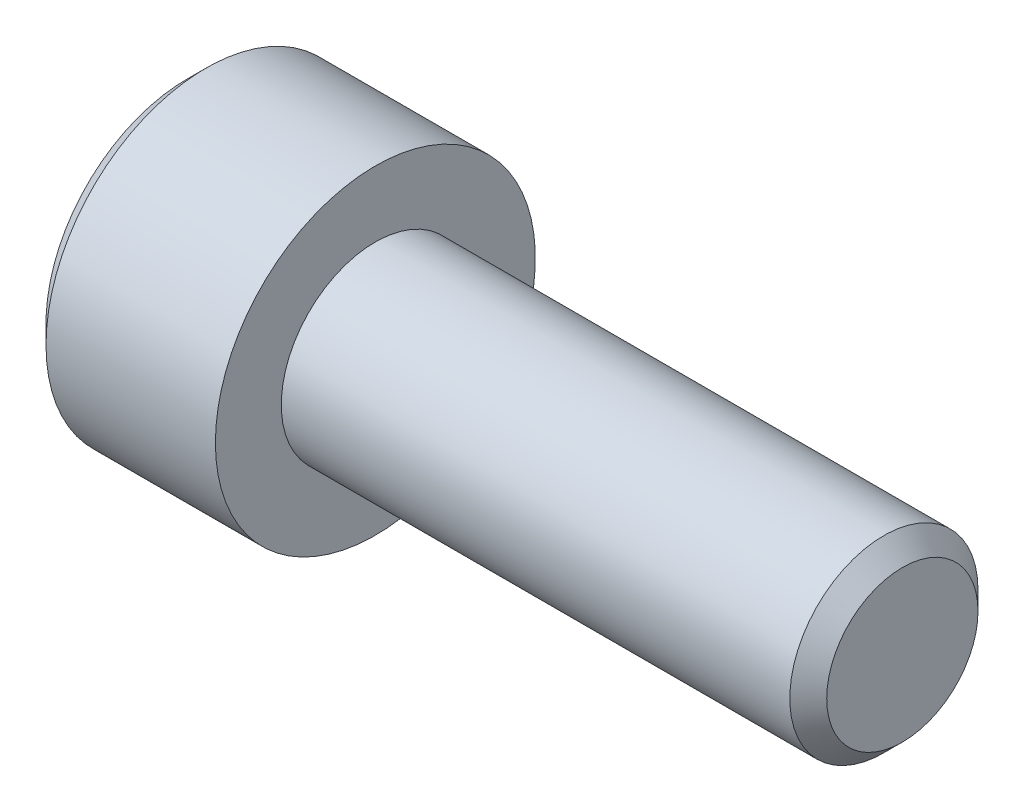
ISO-10303-21;
HEADER;
FILE_DESCRIPTION(('STEP AP214'),'2;1');
FILE_NAME('part.step','',(''),(''),'','','');
FILE_SCHEMA(('AUTOMOTIVE_DESIGN { 1 0 10303 214 1 1 1 1 }'));
ENDSEC;
DATA;
#1=APPLICATION_CONTEXT('core data for automotive mechanical design processes');
#2=APPLICATION_PROTOCOL_DEFINITION('international standard','automotive_design',2000,#1);
#3=PRODUCT_CONTEXT('',#1,'mechanical');
#4=PRODUCT('Part','Part','',(#3));
#5=PRODUCT_RELATED_PRODUCT_CATEGORY('part','',(#4));
#6=PRODUCT_DEFINITION_FORMATION('','',#4);
#7=PRODUCT_DEFINITION_CONTEXT('part definition',#1,'design');
#8=PRODUCT_DEFINITION('design','',#6,#7);
#9=PRODUCT_DEFINITION_SHAPE('','',#8);
#10=(LENGTH_UNIT() NAMED_UNIT(*) SI_UNIT(.MILLI.,.METRE.));
#11=(NAMED_UNIT(*) PLANE_ANGLE_UNIT() SI_UNIT($,.RADIAN.));
#12=(NAMED_UNIT(*) SI_UNIT($,.STERADIAN.) SOLID_ANGLE_UNIT());
#13=UNCERTAINTY_MEASURE_WITH_UNIT(LENGTH_MEASURE(1.E-05),#10,'distance_accuracy_value','');
#14=(GEOMETRIC_REPRESENTATION_CONTEXT(3) GLOBAL_UNCERTAINTY_ASSIGNED_CONTEXT((#13)) GLOBAL_UNIT_ASSIGNED_CONTEXT((#10,
#11,#12)) REPRESENTATION_CONTEXT('',''));
#15=CARTESIAN_POINT('',(0.,0.,0.));
#16=DIRECTION('',(0.,0.,1.));
#17=DIRECTION('',(1.,0.,0.));
#18=AXIS2_PLACEMENT_3D('',#15,#16,#17);
#19=CARTESIAN_POINT('',(-5.,-3.75,3.75));
#20=DIRECTION('',(-1.,0.,0.));
#21=DIRECTION('',(0.,1.,0.));
#22=AXIS2_PLACEMENT_3D('',#19,#20,#21);
#23=PLANE('',#22);
#24=CARTESIAN_POINT('',(-5.,0.,0.));
#25=DIRECTION('',(-1.,0.,0.));
#26=DIRECTION('',(0.,0.,-1.));
#27=AXIS2_PLACEMENT_3D('',#24,#25,#26);
#28=CIRCLE('',#27,3.75);
#29=CARTESIAN_POINT('',(-5.,0.,-3.75));
#30=VERTEX_POINT('',#29);
#31=EDGE_CURVE('E115',#30,#30,#28,.F.);
#32=ORIENTED_EDGE('',*,*,#31,.F.);
#33=EDGE_LOOP('',(#32));
#34=FACE_BOUND('',#33,.T.);
#35=DIRECTION('',(0.,0.499999999999983,-0.866025403784448));
#36=VECTOR('',#35,1.);
#37=CARTESIAN_POINT('',(-5.,-2.3094010767585,0.));
#38=LINE('',#37,#36);
#39=CARTESIAN_POINT('',(-5.,-2.3094010767585,0.));
#40=VERTEX_POINT('',#39);
#41=CARTESIAN_POINT('',(-5.,-1.1547005383793,-2.));
#42=VERTEX_POINT('',#41);
#43=EDGE_CURVE('E100',#40,#42,#38,.T.);
#44=ORIENTED_EDGE('',*,*,#43,.T.);
#45=DIRECTION('',(0.,1.,0.));
#46=VECTOR('',#45,1.);
#47=CARTESIAN_POINT('',(-5.,-1.1547005383793,-2.));
#48=LINE('',#47,#46);
#49=CARTESIAN_POINT('',(-5.,1.1547005383793,-2.));
#50=VERTEX_POINT('',#49);
#51=EDGE_CURVE('E88',#42,#50,#48,.T.);
#52=ORIENTED_EDGE('',*,*,#51,.T.);
#53=DIRECTION('',(0.,0.499999999999983,0.866025403784448));
#54=VECTOR('',#53,1.);
#55=CARTESIAN_POINT('',(-5.,1.1547005383793,-2.));
#56=LINE('',#55,#54);
#57=CARTESIAN_POINT('',(-5.,2.3094010767585,0.));
#58=VERTEX_POINT('',#57);
#59=EDGE_CURVE('E99',#50,#58,#56,.T.);
#60=ORIENTED_EDGE('',*,*,#59,.T.);
#61=DIRECTION('',(0.,-0.499999999999983,0.866025403784448));
#62=VECTOR('',#61,1.);
#63=CARTESIAN_POINT('',(-5.,2.3094010767585,0.));
#64=LINE('',#63,#62);
#65=CARTESIAN_POINT('',(-5.,1.1547005383793,2.));
#66=VERTEX_POINT('',#65);
#67=EDGE_CURVE('E125',#58,#66,#64,.T.);
#68=ORIENTED_EDGE('',*,*,#67,.T.);
#69=DIRECTION('',(0.,-1.,0.));
#70=VECTOR('',#69,1.);
#71=CARTESIAN_POINT('',(-5.,1.1547005383793,2.));
#72=LINE('',#71,#70);
#73=CARTESIAN_POINT('',(-5.,-1.1547005383793,2.));
#74=VERTEX_POINT('',#73);
#75=EDGE_CURVE('E130',#66,#74,#72,.T.);
#76=ORIENTED_EDGE('',*,*,#75,.T.);
#77=DIRECTION('',(0.,-0.499999999999983,-0.866025403784448));
#78=VECTOR('',#77,1.);
#79=CARTESIAN_POINT('',(-5.,-1.1547005383793,2.));
#80=LINE('',#79,#78);
#81=EDGE_CURVE('E114',#74,#40,#80,.T.);
#82=ORIENTED_EDGE('',*,*,#81,.T.);
#83=EDGE_LOOP('',(#44,#52,#60,#68,#76,#82));
#84=FACE_BOUND('',#83,.T.);
#85=ADVANCED_FACE('F16',(#34,#84),#23,.T.);
#86=CARTESIAN_POINT('',(0.,-4.25,-4.25));
#87=DIRECTION('',(1.,0.,0.));
#88=DIRECTION('',(0.,1.,0.));
#89=AXIS2_PLACEMENT_3D('',#86,#87,#88);
#90=PLANE('',#89);
#91=CARTESIAN_POINT('',(0.,0.,0.));
#92=DIRECTION('',(1.,0.,0.));
#93=DIRECTION('',(0.,0.,1.));
#94=AXIS2_PLACEMENT_3D('',#91,#92,#93);
#95=CIRCLE('',#94,4.25);
#96=CARTESIAN_POINT('',(0.,0.,4.25));
#97=VERTEX_POINT('',#96);
#98=EDGE_CURVE('E137',#97,#97,#95,.T.);
#99=ORIENTED_EDGE('',*,*,#98,.T.);
#100=EDGE_LOOP('',(#99));
#101=FACE_BOUND('',#100,.T.);
#102=CARTESIAN_POINT('',(0.,0.,0.));
#103=DIRECTION('',(-1.,0.,0.));
#104=DIRECTION('',(0.,0.,-1.));
#105=AXIS2_PLACEMENT_3D('',#102,#103,#104);
#106=CIRCLE('',#105,2.5);
#107=CARTESIAN_POINT('',(0.,0.,-2.5));
#108=VERTEX_POINT('',#107);
#109=EDGE_CURVE('E142',#108,#108,#106,.F.);
#110=ORIENTED_EDGE('',*,*,#109,.F.);
#111=EDGE_LOOP('',(#110));
#112=FACE_BOUND('',#111,.T.);
#113=ADVANCED_FACE('F264',(#101,#112),#90,.T.);
#114=CARTESIAN_POINT('',(14.,-2.0095,-2.0095));
#115=DIRECTION('',(1.,0.,0.));
#116=DIRECTION('',(0.,1.,0.));
#117=AXIS2_PLACEMENT_3D('',#114,#115,#116);
#118=PLANE('',#117);
#119=CARTESIAN_POINT('',(14.,0.,0.));
#120=DIRECTION('',(1.,0.,0.));
#121=DIRECTION('',(0.,0.,1.));
#122=AXIS2_PLACEMENT_3D('',#119,#120,#121);
#123=CIRCLE('',#122,2.00950000000001);
#124=CARTESIAN_POINT('',(14.,0.,2.00950000000001));
#125=VERTEX_POINT('',#124);
#126=EDGE_CURVE('E145',#125,#125,#123,.T.);
#127=ORIENTED_EDGE('',*,*,#126,.T.);
#128=EDGE_LOOP('',(#127));
#129=FACE_BOUND('',#128,.T.);
#130=ADVANCED_FACE('F270',(#129),#118,.T.);
#131=CARTESIAN_POINT('',(-2.5,-1.1547005383793,2.));
#132=DIRECTION('',(0.,0.,-1.));
#133=DIRECTION('',(-1.,0.,0.));
#134=AXIS2_PLACEMENT_3D('',#131,#132,#133);
#135=PLANE('',#134);
#136=ORIENTED_EDGE('',*,*,#75,.F.);
#137=DIRECTION('',(1.,0.,0.));
#138=VECTOR('',#137,1.);
#139=CARTESIAN_POINT('',(-5.,1.1547005383793,2.));
#140=LINE('',#139,#138);
#141=CARTESIAN_POINT('',(-2.5,1.1547005383793,2.));
#142=VERTEX_POINT('',#141);
#143=EDGE_CURVE('E148',#142,#66,#140,.F.);
#144=ORIENTED_EDGE('',*,*,#143,.F.);
#145=DIRECTION('',(0.,-1.,0.));
#146=VECTOR('',#145,1.);
#147=CARTESIAN_POINT('',(-2.5,1.1547005383793,2.));
#148=LINE('',#147,#146);
#149=CARTESIAN_POINT('',(-2.5,0.,2.));
#150=VERTEX_POINT('',#149);
#151=EDGE_CURVE('E150',#142,#150,#148,.T.);
#152=ORIENTED_EDGE('',*,*,#151,.T.);
#153=DIRECTION('',(0.,-1.,0.));
#154=VECTOR('',#153,1.);
#155=CARTESIAN_POINT('',(-2.5,0.,2.));
#156=LINE('',#155,#154);
#157=CARTESIAN_POINT('',(-2.5,-1.1547005383793,2.));
#158=VERTEX_POINT('',#157);
#159=EDGE_CURVE('E155',#150,#158,#156,.T.);
#160=ORIENTED_EDGE('',*,*,#159,.T.);
#161=DIRECTION('',(-1.,0.,0.));
#162=VECTOR('',#161,1.);
#163=CARTESIAN_POINT('',(-2.5,-1.1547005383793,2.));
#164=LINE('',#163,#162);
#165=EDGE_CURVE('E160',#158,#74,#164,.T.);
#166=ORIENTED_EDGE('',*,*,#165,.T.);
#167=EDGE_LOOP('',(#136,#144,#152,#160,#166));
#168=FACE_BOUND('',#167,.T.);
#169=ADVANCED_FACE('F276',(#168),#135,.T.);
#170=CARTESIAN_POINT('',(-5.,-2.3094010767585,0.));
#171=DIRECTION('',(0.,0.866025403784448,-0.499999999999983));
#172=DIRECTION('',(0.,0.499999999999983,0.866025403784448));
#173=AXIS2_PLACEMENT_3D('',#170,#171,#172);
#174=PLANE('',#173);
#175=ORIENTED_EDGE('',*,*,#81,.F.);
#176=ORIENTED_EDGE('',*,*,#165,.F.);
#177=DIRECTION('',(0.,-0.499999999999983,-0.866025403784448));
#178=VECTOR('',#177,1.);
#179=CARTESIAN_POINT('',(-2.5,-1.1547005383793,2.));
#180=LINE('',#179,#178);
#181=CARTESIAN_POINT('',(-2.5,-1.73205080756891,0.999999999999975));
#182=VERTEX_POINT('',#181);
#183=EDGE_CURVE('E165',#158,#182,#180,.T.);
#184=ORIENTED_EDGE('',*,*,#183,.T.);
#185=DIRECTION('',(0.,-0.499999999999983,-0.866025403784448));
#186=VECTOR('',#185,1.);
#187=CARTESIAN_POINT('',(-2.5,-1.73205080756891,0.999999999999975));
#188=LINE('',#187,#186);
#189=CARTESIAN_POINT('',(-2.5,-2.3094010767585,0.));
#190=VERTEX_POINT('',#189);
#191=EDGE_CURVE('E170',#182,#190,#188,.T.);
#192=ORIENTED_EDGE('',*,*,#191,.T.);
#193=DIRECTION('',(-1.,0.,0.));
#194=VECTOR('',#193,1.);
#195=CARTESIAN_POINT('',(-2.5,-2.3094010767585,0.));
#196=LINE('',#195,#194);
#197=EDGE_CURVE('E175',#190,#40,#196,.T.);
#198=ORIENTED_EDGE('',*,*,#197,.T.);
#199=EDGE_LOOP('',(#175,#176,#184,#192,#198));
#200=FACE_BOUND('',#199,.T.);
#201=ADVANCED_FACE('F280',(#200),#174,.T.);
#202=CARTESIAN_POINT('',(-5.,-1.1547005383793,-2.));
#203=DIRECTION('',(0.,0.866025403784448,0.499999999999983));
#204=DIRECTION('',(0.,-0.499999999999983,0.866025403784448));
#205=AXIS2_PLACEMENT_3D('',#202,#203,#204);
#206=PLANE('',#205);
#207=ORIENTED_EDGE('',*,*,#43,.F.);
#208=ORIENTED_EDGE('',*,*,#197,.F.);
#209=DIRECTION('',(0.,0.499999999999983,-0.866025403784448));
#210=VECTOR('',#209,1.);
#211=CARTESIAN_POINT('',(-2.5,-2.3094010767585,0.));
#212=LINE('',#211,#210);
#213=CARTESIAN_POINT('',(-2.5,-1.73205080756891,-0.999999999999977));
#214=VERTEX_POINT('',#213);
#215=EDGE_CURVE('E179',#190,#214,#212,.T.);
#216=ORIENTED_EDGE('',*,*,#215,.T.);
#217=DIRECTION('',(0.,0.499999999999983,-0.866025403784448));
#218=VECTOR('',#217,1.);
#219=CARTESIAN_POINT('',(-2.5,-1.73205080756891,-0.999999999999977));
#220=LINE('',#219,#218);
#221=CARTESIAN_POINT('',(-2.5,-1.1547005383793,-2.));
#222=VERTEX_POINT('',#221);
#223=EDGE_CURVE('E109',#214,#222,#220,.T.);
#224=ORIENTED_EDGE('',*,*,#223,.T.);
#225=DIRECTION('',(-1.,0.,0.));
#226=VECTOR('',#225,1.);
#227=CARTESIAN_POINT('',(-2.5,-1.1547005383793,-2.));
#228=LINE('',#227,#226);
#229=EDGE_CURVE('E92',#222,#42,#228,.T.);
#230=ORIENTED_EDGE('',*,*,#229,.T.);
#231=EDGE_LOOP('',(#207,#208,#216,#224,#230));
#232=FACE_BOUND('',#231,.T.);
#233=ADVANCED_FACE('F104',(#232),#206,.T.);
#234=CARTESIAN_POINT('',(-5.,-1.1547005383793,-2.));
#235=DIRECTION('',(0.,0.,1.));
#236=DIRECTION('',(1.,0.,0.));
#237=AXIS2_PLACEMENT_3D('',#234,#235,#236);
#238=PLANE('',#237);
#239=ORIENTED_EDGE('',*,*,#51,.F.);
#240=ORIENTED_EDGE('',*,*,#229,.F.);
#241=DIRECTION('',(0.,1.,0.));
#242=VECTOR('',#241,1.);
#243=CARTESIAN_POINT('',(-2.5,-1.1547005383793,-2.));
#244=LINE('',#243,#242);
#245=CARTESIAN_POINT('',(-2.5,0.,-2.));
#246=VERTEX_POINT('',#245);
#247=EDGE_CURVE('E110',#222,#246,#244,.T.);
#248=ORIENTED_EDGE('',*,*,#247,.T.);
#249=DIRECTION('',(0.,1.,0.));
#250=VECTOR('',#249,1.);
#251=CARTESIAN_POINT('',(-2.5,0.,-2.));
#252=LINE('',#251,#250);
#253=CARTESIAN_POINT('',(-2.5,1.1547005383793,-2.));
#254=VERTEX_POINT('',#253);
#255=EDGE_CURVE('E191',#246,#254,#252,.T.);
#256=ORIENTED_EDGE('',*,*,#255,.T.);
#257=DIRECTION('',(-1.,0.,0.));
#258=VECTOR('',#257,1.);
#259=CARTESIAN_POINT('',(-2.5,1.1547005383793,-2.));
#260=LINE('',#259,#258);
#261=EDGE_CURVE('E95',#254,#50,#260,.T.);
#262=ORIENTED_EDGE('',*,*,#261,.T.);
#263=EDGE_LOOP('',(#239,#240,#248,#256,#262));
#264=FACE_BOUND('',#263,.T.);
#265=ADVANCED_FACE('F90',(#264),#238,.T.);
#266=CARTESIAN_POINT('',(-5.,2.3094010767585,0.));
#267=DIRECTION('',(0.,-0.866025403784448,0.499999999999983));
#268=DIRECTION('',(0.,-0.499999999999983,-0.866025403784448));
#269=AXIS2_PLACEMENT_3D('',#266,#267,#268);
#270=PLANE('',#269);
#271=ORIENTED_EDGE('',*,*,#59,.F.);
#272=ORIENTED_EDGE('',*,*,#261,.F.);
#273=DIRECTION('',(0.,0.499999999999983,0.866025403784448));
#274=VECTOR('',#273,1.);
#275=CARTESIAN_POINT('',(-2.5,1.1547005383793,-2.));
#276=LINE('',#275,#274);
#277=CARTESIAN_POINT('',(-2.5,1.73205080756891,-0.999999999999975));
#278=VERTEX_POINT('',#277);
#279=EDGE_CURVE('E198',#254,#278,#276,.T.);
#280=ORIENTED_EDGE('',*,*,#279,.T.);
#281=DIRECTION('',(0.,0.499999999999983,0.866025403784448));
#282=VECTOR('',#281,1.);
#283=CARTESIAN_POINT('',(-2.5,1.73205080756891,-0.999999999999975));
#284=LINE('',#283,#282);
#285=CARTESIAN_POINT('',(-2.5,2.3094010767585,0.));
#286=VERTEX_POINT('',#285);
#287=EDGE_CURVE('E203',#278,#286,#284,.T.);
#288=ORIENTED_EDGE('',*,*,#287,.T.);
#289=DIRECTION('',(-1.,0.,0.));
#290=VECTOR('',#289,1.);
#291=CARTESIAN_POINT('',(-2.5,2.3094010767585,0.));
#292=LINE('',#291,#290);
#293=EDGE_CURVE('E208',#286,#58,#292,.T.);
#294=ORIENTED_EDGE('',*,*,#293,.T.);
#295=EDGE_LOOP('',(#271,#272,#280,#288,#294));
#296=FACE_BOUND('',#295,.T.);
#297=ADVANCED_FACE('F289',(#296),#270,.T.);
#298=CARTESIAN_POINT('',(-5.,1.1547005383793,2.));
#299=DIRECTION('',(0.,-0.866025403784448,-0.499999999999983));
#300=DIRECTION('',(0.,0.499999999999983,-0.866025403784448));
#301=AXIS2_PLACEMENT_3D('',#298,#299,#300);
#302=PLANE('',#301);
#303=ORIENTED_EDGE('',*,*,#67,.F.);
#304=ORIENTED_EDGE('',*,*,#293,.F.);
#305=DIRECTION('',(0.,-0.499999999999983,0.866025403784448));
#306=VECTOR('',#305,1.);
#307=CARTESIAN_POINT('',(-2.5,2.3094010767585,0.));
#308=LINE('',#307,#306);
#309=CARTESIAN_POINT('',(-2.5,1.73205080756891,0.999999999999976));
#310=VERTEX_POINT('',#309);
#311=EDGE_CURVE('E213',#286,#310,#308,.T.);
#312=ORIENTED_EDGE('',*,*,#311,.T.);
#313=DIRECTION('',(0.,-0.499999999999983,0.866025403784448));
#314=VECTOR('',#313,1.);
#315=CARTESIAN_POINT('',(-2.5,1.73205080756891,0.999999999999975));
#316=LINE('',#315,#314);
#317=EDGE_CURVE('E218',#310,#142,#316,.T.);
#318=ORIENTED_EDGE('',*,*,#317,.T.);
#319=ORIENTED_EDGE('',*,*,#143,.T.);
#320=EDGE_LOOP('',(#303,#304,#312,#318,#319));
#321=FACE_BOUND('',#320,.T.);
#322=ADVANCED_FACE('F292',(#321),#302,.T.);
#323=CARTESIAN_POINT('',(-2.5,0.,-0.999999999999974));
#324=DIRECTION('',(-1.,0.,0.));
#325=DIRECTION('',(0.,1.,0.));
#326=AXIS2_PLACEMENT_3D('',#323,#324,#325);
#327=PLANE('',#326);
#328=CARTESIAN_POINT('',(-2.5,0.,0.));
#329=DIRECTION('',(1.,0.,0.));
#330=DIRECTION('',(0.,0.,-1.));
#331=AXIS2_PLACEMENT_3D('',#328,#329,#330);
#332=CIRCLE('',#331,2.);
#333=EDGE_CURVE('E223',#246,#278,#332,.T.);
#334=ORIENTED_EDGE('',*,*,#333,.T.);
#335=ORIENTED_EDGE('',*,*,#279,.F.);
#336=ORIENTED_EDGE('',*,*,#255,.F.);
#337=EDGE_LOOP('',(#334,#335,#336));
#338=FACE_BOUND('',#337,.T.);
#339=ADVANCED_FACE('F296',(#338),#327,.T.);
#340=CARTESIAN_POINT('',(-2.5,1.7320508075689,0.999999999999976));
#341=DIRECTION('',(-1.,0.,0.));
#342=DIRECTION('',(0.,1.,0.));
#343=AXIS2_PLACEMENT_3D('',#340,#341,#342);
#344=PLANE('',#343);
#345=ORIENTED_EDGE('',*,*,#287,.F.);
#346=CARTESIAN_POINT('',(-2.5,0.,0.));
#347=DIRECTION('',(1.,0.,0.));
#348=DIRECTION('',(0.,0.866025403784449,-0.499999999999983));
#349=AXIS2_PLACEMENT_3D('',#346,#347,#348);
#350=CIRCLE('',#349,2.);
#351=EDGE_CURVE('E228',#278,#310,#350,.T.);
#352=ORIENTED_EDGE('',*,*,#351,.T.);
#353=ORIENTED_EDGE('',*,*,#311,.F.);
#354=EDGE_LOOP('',(#345,#352,#353));
#355=FACE_BOUND('',#354,.T.);
#356=ADVANCED_FACE('F300',(#355),#344,.T.);
#357=CARTESIAN_POINT('',(-2.5,0.,2.));
#358=DIRECTION('',(-1.,0.,0.));
#359=DIRECTION('',(0.,1.,0.));
#360=AXIS2_PLACEMENT_3D('',#357,#358,#359);
#361=PLANE('',#360);
#362=CARTESIAN_POINT('',(-2.5,0.,0.));
#363=DIRECTION('',(1.,0.,0.));
#364=DIRECTION('',(0.,0.866025403784449,0.499999999999983));
#365=AXIS2_PLACEMENT_3D('',#362,#363,#364);
#366=CIRCLE('',#365,2.);
#367=EDGE_CURVE('E34',#310,#150,#366,.T.);
#368=ORIENTED_EDGE('',*,*,#367,.T.);
#369=ORIENTED_EDGE('',*,*,#151,.F.);
#370=ORIENTED_EDGE('',*,*,#317,.F.);
#371=EDGE_LOOP('',(#368,#369,#370));
#372=FACE_BOUND('',#371,.T.);
#373=ADVANCED_FACE('F304',(#372),#361,.T.);
#374=CARTESIAN_POINT('',(-2.5,-1.73205080756891,2.));
#375=DIRECTION('',(-1.,0.,0.));
#376=DIRECTION('',(0.,1.,0.));
#377=AXIS2_PLACEMENT_3D('',#374,#375,#376);
#378=PLANE('',#377);
#379=CARTESIAN_POINT('',(-2.5,0.,0.));
#380=DIRECTION('',(1.,0.,0.));
#381=DIRECTION('',(0.,0.,1.));
#382=AXIS2_PLACEMENT_3D('',#379,#380,#381);
#383=CIRCLE('',#382,2.);
#384=EDGE_CURVE('E235',#150,#182,#383,.T.);
#385=ORIENTED_EDGE('',*,*,#384,.T.);
#386=ORIENTED_EDGE('',*,*,#183,.F.);
#387=ORIENTED_EDGE('',*,*,#159,.F.);
#388=EDGE_LOOP('',(#385,#386,#387));
#389=FACE_BOUND('',#388,.T.);
#390=ADVANCED_FACE('F308',(#389),#378,.T.);
#391=CARTESIAN_POINT('',(-2.5,-2.3094010767585,0.999999999999975));
#392=DIRECTION('',(-1.,0.,0.));
#393=DIRECTION('',(0.,1.,0.));
#394=AXIS2_PLACEMENT_3D('',#391,#392,#393);
#395=PLANE('',#394);
#396=CARTESIAN_POINT('',(-2.5,0.,0.));
#397=DIRECTION('',(1.,0.,0.));
#398=DIRECTION('',(0.,-0.866025403784449,0.499999999999983));
#399=AXIS2_PLACEMENT_3D('',#396,#397,#398);
#400=CIRCLE('',#399,2.);
#401=EDGE_CURVE('E240',#182,#214,#400,.T.);
#402=ORIENTED_EDGE('',*,*,#401,.T.);
#403=ORIENTED_EDGE('',*,*,#215,.F.);
#404=ORIENTED_EDGE('',*,*,#191,.F.);
#405=EDGE_LOOP('',(#402,#403,#404));
#406=FACE_BOUND('',#405,.T.);
#407=ADVANCED_FACE('F312',(#406),#395,.T.);
#408=CARTESIAN_POINT('',(-2.5,-1.73205080756891,-0.999999999999975));
#409=DIRECTION('',(-1.,0.,0.));
#410=DIRECTION('',(0.,1.,0.));
#411=AXIS2_PLACEMENT_3D('',#408,#409,#410);
#412=PLANE('',#411);
#413=CARTESIAN_POINT('',(-2.5,0.,0.));
#414=DIRECTION('',(1.,0.,0.));
#415=DIRECTION('',(0.,-0.866025403784448,-0.499999999999983));
#416=AXIS2_PLACEMENT_3D('',#413,#414,#415);
#417=CIRCLE('',#416,2.);
#418=EDGE_CURVE('E245',#214,#246,#417,.T.);
#419=ORIENTED_EDGE('',*,*,#418,.T.);
#420=ORIENTED_EDGE('',*,*,#247,.F.);
#421=ORIENTED_EDGE('',*,*,#223,.F.);
#422=EDGE_LOOP('',(#419,#420,#421));
#423=FACE_BOUND('',#422,.T.);
#424=ADVANCED_FACE('F259',(#423),#412,.T.);
#425=CARTESIAN_POINT('',(-4.5,0.,0.));
#426=DIRECTION('',(1.,0.,0.));
#427=DIRECTION('',(0.,1.92325389288125E-10,1.));
#428=AXIS2_PLACEMENT_3D('',#425,#426,#427);
#429=CONICAL_SURFACE('',#428,4.25,0.785398163397452);
#430=CARTESIAN_POINT('',(-4.5,0.,0.));
#431=DIRECTION('',(-1.,0.,0.));
#432=DIRECTION('',(0.,0.,-1.));
#433=AXIS2_PLACEMENT_3D('',#430,#431,#432);
#434=CIRCLE('',#433,4.25);
#435=CARTESIAN_POINT('',(-4.5,0.,-4.25));
#436=VERTEX_POINT('',#435);
#437=EDGE_CURVE('E24',#436,#436,#434,.F.);
#438=ORIENTED_EDGE('',*,*,#437,.F.);
#439=EDGE_LOOP('',(#438));
#440=FACE_BOUND('',#439,.T.);
#441=ORIENTED_EDGE('',*,*,#31,.T.);
#442=EDGE_LOOP('',(#441));
#443=FACE_BOUND('',#442,.T.);
#444=ADVANCED_FACE('F256',(#440,#443),#429,.T.);
#445=CARTESIAN_POINT('',(14.,0.,0.));
#446=DIRECTION('',(1.,0.,0.));
#447=DIRECTION('',(0.,7.69302077936881E-10,1.));
#448=AXIS2_PLACEMENT_3D('',#445,#446,#447);
#449=CYLINDRICAL_SURFACE('',#448,4.25);
#450=ORIENTED_EDGE('',*,*,#98,.F.);
#451=EDGE_LOOP('',(#450));
#452=FACE_BOUND('',#451,.T.);
#453=ORIENTED_EDGE('',*,*,#437,.T.);
#454=EDGE_LOOP('',(#453));
#455=FACE_BOUND('',#454,.T.);
#456=ADVANCED_FACE('F254',(#452,#455),#449,.T.);
#457=CARTESIAN_POINT('',(14.,0.,0.));
#458=DIRECTION('',(1.,0.,0.));
#459=DIRECTION('',(0.,0.,1.));
#460=AXIS2_PLACEMENT_3D('',#457,#458,#459);
#461=CYLINDRICAL_SURFACE('',#460,2.5);
#462=CARTESIAN_POINT('',(13.5095,0.,0.));
#463=DIRECTION('',(-1.,0.,0.));
#464=DIRECTION('',(0.,0.,-1.));
#465=AXIS2_PLACEMENT_3D('',#462,#463,#464);
#466=CIRCLE('',#465,2.5);
#467=CARTESIAN_POINT('',(13.5095,0.,-2.5));
#468=VERTEX_POINT('',#467);
#469=EDGE_CURVE('E10',#468,#468,#466,.F.);
#470=ORIENTED_EDGE('',*,*,#469,.F.);
#471=EDGE_LOOP('',(#470));
#472=FACE_BOUND('',#471,.T.);
#473=ORIENTED_EDGE('',*,*,#109,.T.);
#474=EDGE_LOOP('',(#473));
#475=FACE_BOUND('',#474,.T.);
#476=ADVANCED_FACE('F322',(#472,#475),#461,.T.);
#477=CARTESIAN_POINT('',(13.5095,0.,0.));
#478=DIRECTION('',(-1.,0.,0.));
#479=DIRECTION('',(0.,0.,-1.));
#480=AXIS2_PLACEMENT_3D('',#477,#478,#479);
#481=CONICAL_SURFACE('',#480,2.5,0.785398163397446);
#482=ORIENTED_EDGE('',*,*,#126,.F.);
#483=EDGE_LOOP('',(#482));
#484=FACE_BOUND('',#483,.T.);
#485=ORIENTED_EDGE('',*,*,#469,.T.);
#486=EDGE_LOOP('',(#485));
#487=FACE_BOUND('',#486,.T.);
#488=ADVANCED_FACE('F325',(#484,#487),#481,.T.);
#489=CARTESIAN_POINT('',(-2.5,0.,0.));
#490=DIRECTION('',(-1.,0.,0.));
#491=DIRECTION('',(0.,0.,-1.));
#492=AXIS2_PLACEMENT_3D('',#489,#490,#491);
#493=CONICAL_SURFACE('',#492,2.00000000000002,1.30899693899577);
#494=ORIENTED_EDGE('',*,*,#418,.F.);
#495=ORIENTED_EDGE('',*,*,#401,.F.);
#496=ORIENTED_EDGE('',*,*,#384,.F.);
#497=ORIENTED_EDGE('',*,*,#367,.F.);
#498=ORIENTED_EDGE('',*,*,#351,.F.);
#499=ORIENTED_EDGE('',*,*,#333,.F.);
#500=EDGE_LOOP('',(#494,#495,#496,#497,#498,#499));
#501=FACE_BOUND('',#500,.T.);
#502=CARTESIAN_POINT('',(-1.9641016151378,0.,0.));
#503=VERTEX_POINT('',#502);
#504=VERTEX_LOOP('',#503);
#505=FACE_BOUND('',#504,.T.);
#506=ADVANCED_FACE('F18',(#501,#505),#493,.F.);
#507=CLOSED_SHELL('',(#85,#113,#130,#169,#201,#233,#265,#297,#322,#339,#356,#373,#390,#407,#424,
#444,#456,#476,#488,#506));
#508=MANIFOLD_SOLID_BREP('B1',#507);
#509=ADVANCED_BREP_SHAPE_REPRESENTATION('',(#18,#508),#14);
#510=SHAPE_DEFINITION_REPRESENTATION(#9,#509);
ENDSEC;
END-ISO-10303-21;
